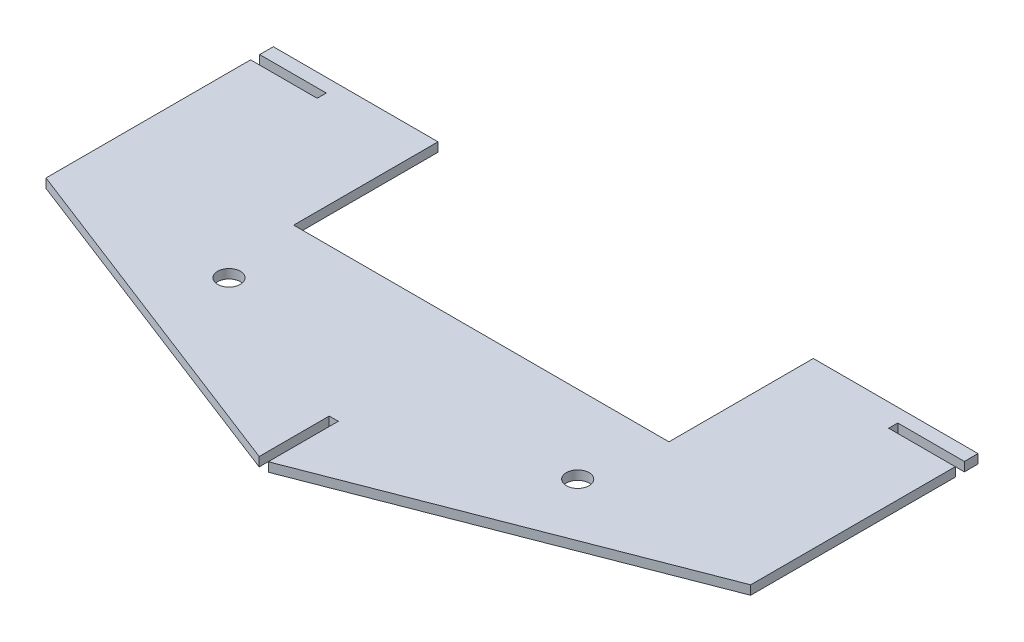
ISO-10303-21;
HEADER;
FILE_DESCRIPTION(('STEP AP214'),'2;1');
FILE_NAME('part.step','',(''),(''),'','','');
FILE_SCHEMA(('AUTOMOTIVE_DESIGN { 1 0 10303 214 1 1 1 1 }'));
ENDSEC;
DATA;
#1=APPLICATION_CONTEXT('core data for automotive mechanical design processes');
#2=APPLICATION_PROTOCOL_DEFINITION('international standard','automotive_design',2000,#1);
#3=PRODUCT_CONTEXT('',#1,'mechanical');
#4=PRODUCT('Part','Part','',(#3));
#5=PRODUCT_RELATED_PRODUCT_CATEGORY('part','',(#4));
#6=PRODUCT_DEFINITION_FORMATION('','',#4);
#7=PRODUCT_DEFINITION_CONTEXT('part definition',#1,'design');
#8=PRODUCT_DEFINITION('design','',#6,#7);
#9=PRODUCT_DEFINITION_SHAPE('','',#8);
#10=(LENGTH_UNIT() NAMED_UNIT(*) SI_UNIT(.MILLI.,.METRE.));
#11=(NAMED_UNIT(*) PLANE_ANGLE_UNIT() SI_UNIT($,.RADIAN.));
#12=(NAMED_UNIT(*) SI_UNIT($,.STERADIAN.) SOLID_ANGLE_UNIT());
#13=UNCERTAINTY_MEASURE_WITH_UNIT(LENGTH_MEASURE(1.E-05),#10,'distance_accuracy_value','');
#14=(GEOMETRIC_REPRESENTATION_CONTEXT(3) GLOBAL_UNCERTAINTY_ASSIGNED_CONTEXT((#13)) GLOBAL_UNIT_ASSIGNED_CONTEXT((#10,
#11,#12)) REPRESENTATION_CONTEXT('',''));
#15=CARTESIAN_POINT('',(0.,0.,0.));
#16=DIRECTION('',(0.,0.,1.));
#17=DIRECTION('',(1.,0.,0.));
#18=AXIS2_PLACEMENT_3D('',#15,#16,#17);
#19=CARTESIAN_POINT('',(0.,4.,0.));
#20=DIRECTION('',(0.,1.,0.));
#21=DIRECTION('',(0.,0.,1.));
#22=AXIS2_PLACEMENT_3D('',#19,#20,#21);
#23=PLANE('',#22);
#24=CARTESIAN_POINT('',(231.7,4.,97.8));
#25=DIRECTION('',(0.,1.,0.));
#26=DIRECTION('',(0.,0.,1.));
#27=AXIS2_PLACEMENT_3D('',#24,#25,#26);
#28=CIRCLE('',#27,5.00000000000002);
#29=CARTESIAN_POINT('',(231.7,4.,102.8));
#30=VERTEX_POINT('',#29);
#31=EDGE_CURVE('E269',#30,#30,#28,.F.);
#32=ORIENTED_EDGE('',*,*,#31,.T.);
#33=EDGE_LOOP('',(#32));
#34=FACE_BOUND('',#33,.T.);
#35=DIRECTION('',(0.,0.,1.));
#36=VECTOR('',#35,1.);
#37=CARTESIAN_POINT('',(72.45,4.,0.));
#38=LINE('',#37,#36);
#39=CARTESIAN_POINT('',(72.45,4.,0.));
#40=VERTEX_POINT('',#39);
#41=CARTESIAN_POINT('',(72.45,4.,63.5));
#42=VERTEX_POINT('',#41);
#43=EDGE_CURVE('E267',#40,#42,#38,.T.);
#44=ORIENTED_EDGE('',*,*,#43,.F.);
#45=DIRECTION('',(1.,0.,0.));
#46=VECTOR('',#45,1.);
#47=CARTESIAN_POINT('',(0.,4.,0.));
#48=LINE('',#47,#46);
#49=CARTESIAN_POINT('',(0.,4.,0.));
#50=VERTEX_POINT('',#49);
#51=EDGE_CURVE('E314',#50,#40,#48,.T.);
#52=ORIENTED_EDGE('',*,*,#51,.F.);
#53=DIRECTION('',(0.,0.,1.));
#54=VECTOR('',#53,1.);
#55=CARTESIAN_POINT('',(0.,4.,0.));
#56=LINE('',#55,#54);
#57=CARTESIAN_POINT('',(0.,4.,6.));
#58=VERTEX_POINT('',#57);
#59=EDGE_CURVE('E317',#50,#58,#56,.T.);
#60=ORIENTED_EDGE('',*,*,#59,.T.);
#61=DIRECTION('',(1.,0.,0.));
#62=VECTOR('',#61,1.);
#63=CARTESIAN_POINT('',(0.,4.,6.));
#64=LINE('',#63,#62);
#65=CARTESIAN_POINT('',(29.3,4.,6.));
#66=VERTEX_POINT('',#65);
#67=EDGE_CURVE('E320',#58,#66,#64,.T.);
#68=ORIENTED_EDGE('',*,*,#67,.T.);
#69=DIRECTION('',(0.,0.,1.));
#70=VECTOR('',#69,1.);
#71=CARTESIAN_POINT('',(29.3,4.,0.));
#72=LINE('',#71,#70);
#73=CARTESIAN_POINT('',(29.3,4.,10.));
#74=VERTEX_POINT('',#73);
#75=EDGE_CURVE('E323',#66,#74,#72,.T.);
#76=ORIENTED_EDGE('',*,*,#75,.T.);
#77=DIRECTION('',(1.,0.,0.));
#78=VECTOR('',#77,1.);
#79=CARTESIAN_POINT('',(0.,4.,10.));
#80=LINE('',#79,#78);
#81=CARTESIAN_POINT('',(0.,4.,10.));
#82=VERTEX_POINT('',#81);
#83=EDGE_CURVE('E325',#82,#74,#80,.T.);
#84=ORIENTED_EDGE('',*,*,#83,.F.);
#85=CARTESIAN_POINT('',(0.,4.,100.));
#86=VERTEX_POINT('',#85);
#87=EDGE_CURVE('E321',#82,#86,#56,.T.);
#88=ORIENTED_EDGE('',*,*,#87,.T.);
#89=DIRECTION('',(0.93256809827409,0.,0.360994102557712));
#90=VECTOR('',#89,1.);
#91=CARTESIAN_POINT('',(-33.6651583710407,4.,86.9683257918552));
#92=LINE('',#91,#90);
#93=CARTESIAN_POINT('',(153.,4.,159.225806451613));
#94=VERTEX_POINT('',#93);
#95=EDGE_CURVE('E173',#86,#94,#92,.T.);
#96=ORIENTED_EDGE('',*,*,#95,.T.);
#97=DIRECTION('',(0.,0.,-1.));
#98=VECTOR('',#97,1.);
#99=CARTESIAN_POINT('',(153.,4.,0.));
#100=LINE('',#99,#98);
#101=CARTESIAN_POINT('',(153.,4.,128.4));
#102=VERTEX_POINT('',#101);
#103=EDGE_CURVE('E165',#94,#102,#100,.T.);
#104=ORIENTED_EDGE('',*,*,#103,.T.);
#105=DIRECTION('',(1.,0.,0.));
#106=VECTOR('',#105,1.);
#107=CARTESIAN_POINT('',(0.,4.,128.4));
#108=LINE('',#107,#106);
#109=CARTESIAN_POINT('',(157.,4.,128.4));
#110=VERTEX_POINT('',#109);
#111=EDGE_CURVE('E170',#102,#110,#108,.T.);
#112=ORIENTED_EDGE('',*,*,#111,.T.);
#113=DIRECTION('',(0.,0.,-1.));
#114=VECTOR('',#113,1.);
#115=CARTESIAN_POINT('',(157.,4.,0.));
#116=LINE('',#115,#114);
#117=CARTESIAN_POINT('',(157.,4.,159.225806451613));
#118=VERTEX_POINT('',#117);
#119=EDGE_CURVE('E190',#118,#110,#116,.T.);
#120=ORIENTED_EDGE('',*,*,#119,.F.);
#121=DIRECTION('',(0.93256809827409,0.,-0.360994102557712));
#122=VECTOR('',#121,1.);
#123=CARTESIAN_POINT('',(74.0633484162896,4.,191.330316742081));
#124=LINE('',#123,#122);
#125=CARTESIAN_POINT('',(310.,4.,100.));
#126=VERTEX_POINT('',#125);
#127=EDGE_CURVE('E123',#118,#126,#124,.T.);
#128=ORIENTED_EDGE('',*,*,#127,.T.);
#129=DIRECTION('',(0.,0.,1.));
#130=VECTOR('',#129,1.);
#131=CARTESIAN_POINT('',(310.,4.,0.));
#132=LINE('',#131,#130);
#133=CARTESIAN_POINT('',(310.,4.,10.));
#134=VERTEX_POINT('',#133);
#135=EDGE_CURVE('E302',#134,#126,#132,.T.);
#136=ORIENTED_EDGE('',*,*,#135,.F.);
#137=DIRECTION('',(-1.,0.,0.));
#138=VECTOR('',#137,1.);
#139=CARTESIAN_POINT('',(0.,4.,10.));
#140=LINE('',#139,#138);
#141=CARTESIAN_POINT('',(280.7,4.,10.));
#142=VERTEX_POINT('',#141);
#143=EDGE_CURVE('E305',#134,#142,#140,.T.);
#144=ORIENTED_EDGE('',*,*,#143,.T.);
#145=DIRECTION('',(0.,0.,1.));
#146=VECTOR('',#145,1.);
#147=CARTESIAN_POINT('',(280.7,4.,0.));
#148=LINE('',#147,#146);
#149=CARTESIAN_POINT('',(280.7,4.,6.));
#150=VERTEX_POINT('',#149);
#151=EDGE_CURVE('E308',#150,#142,#148,.T.);
#152=ORIENTED_EDGE('',*,*,#151,.F.);
#153=DIRECTION('',(-1.,0.,0.));
#154=VECTOR('',#153,1.);
#155=CARTESIAN_POINT('',(0.,4.,5.99999999999999));
#156=LINE('',#155,#154);
#157=CARTESIAN_POINT('',(310.,4.,6.));
#158=VERTEX_POINT('',#157);
#159=EDGE_CURVE('E311',#158,#150,#156,.T.);
#160=ORIENTED_EDGE('',*,*,#159,.F.);
#161=CARTESIAN_POINT('',(310.,4.,0.));
#162=VERTEX_POINT('',#161);
#163=EDGE_CURVE('E306',#162,#158,#132,.T.);
#164=ORIENTED_EDGE('',*,*,#163,.F.);
#165=CARTESIAN_POINT('',(237.55,4.,0.));
#166=VERTEX_POINT('',#165);
#167=EDGE_CURVE('E318',#166,#162,#48,.T.);
#168=ORIENTED_EDGE('',*,*,#167,.F.);
#169=DIRECTION('',(0.,0.,-1.));
#170=VECTOR('',#169,1.);
#171=CARTESIAN_POINT('',(237.55,4.,0.));
#172=LINE('',#171,#170);
#173=CARTESIAN_POINT('',(237.55,4.,63.5));
#174=VERTEX_POINT('',#173);
#175=EDGE_CURVE('E280',#174,#166,#172,.T.);
#176=ORIENTED_EDGE('',*,*,#175,.F.);
#177=DIRECTION('',(1.,0.,0.));
#178=VECTOR('',#177,1.);
#179=CARTESIAN_POINT('',(72.45,4.,63.5));
#180=LINE('',#179,#178);
#181=EDGE_CURVE('E287',#42,#174,#180,.T.);
#182=ORIENTED_EDGE('',*,*,#181,.F.);
#183=EDGE_LOOP('',(#44,#52,#60,#68,#76,#84,#88,#96,#104,#112,#120,#128,#136,#144,#152,#160,#164,
#168,#176,#182));
#184=FACE_BOUND('',#183,.T.);
#185=CARTESIAN_POINT('',(78.3,4.,97.8));
#186=DIRECTION('',(0.,1.,0.));
#187=DIRECTION('',(0.,0.,1.));
#188=AXIS2_PLACEMENT_3D('',#185,#186,#187);
#189=CIRCLE('',#188,5.00000000000001);
#190=CARTESIAN_POINT('',(78.3,4.,102.8));
#191=VERTEX_POINT('',#190);
#192=EDGE_CURVE('E263',#191,#191,#189,.T.);
#193=ORIENTED_EDGE('',*,*,#192,.F.);
#194=EDGE_LOOP('',(#193));
#195=FACE_BOUND('',#194,.T.);
#196=ADVANCED_FACE('F35',(#34,#184,#195),#23,.T.);
#197=CARTESIAN_POINT('',(0.,0.,0.));
#198=DIRECTION('',(0.,1.,0.));
#199=DIRECTION('',(0.,0.,1.));
#200=AXIS2_PLACEMENT_3D('',#197,#198,#199);
#201=PLANE('',#200);
#202=DIRECTION('',(1.,0.,0.));
#203=VECTOR('',#202,1.);
#204=CARTESIAN_POINT('',(0.,0.,0.));
#205=LINE('',#204,#203);
#206=CARTESIAN_POINT('',(0.,0.,0.));
#207=VERTEX_POINT('',#206);
#208=CARTESIAN_POINT('',(72.45,0.,0.));
#209=VERTEX_POINT('',#208);
#210=EDGE_CURVE('E211',#207,#209,#205,.T.);
#211=ORIENTED_EDGE('',*,*,#210,.T.);
#212=DIRECTION('',(0.,0.,1.));
#213=VECTOR('',#212,1.);
#214=CARTESIAN_POINT('',(72.45,0.,0.));
#215=LINE('',#214,#213);
#216=CARTESIAN_POINT('',(72.45,0.,63.5));
#217=VERTEX_POINT('',#216);
#218=EDGE_CURVE('E276',#209,#217,#215,.T.);
#219=ORIENTED_EDGE('',*,*,#218,.T.);
#220=DIRECTION('',(1.,0.,0.));
#221=VECTOR('',#220,1.);
#222=CARTESIAN_POINT('',(72.45,0.,63.5));
#223=LINE('',#222,#221);
#224=CARTESIAN_POINT('',(237.55,0.,63.5));
#225=VERTEX_POINT('',#224);
#226=EDGE_CURVE('E279',#217,#225,#223,.T.);
#227=ORIENTED_EDGE('',*,*,#226,.T.);
#228=DIRECTION('',(0.,0.,-1.));
#229=VECTOR('',#228,1.);
#230=CARTESIAN_POINT('',(237.55,0.,0.));
#231=LINE('',#230,#229);
#232=CARTESIAN_POINT('',(237.55,0.,0.));
#233=VERTEX_POINT('',#232);
#234=EDGE_CURVE('E52',#225,#233,#231,.T.);
#235=ORIENTED_EDGE('',*,*,#234,.T.);
#236=CARTESIAN_POINT('',(310.,0.,0.));
#237=VERTEX_POINT('',#236);
#238=EDGE_CURVE('E215',#233,#237,#205,.T.);
#239=ORIENTED_EDGE('',*,*,#238,.T.);
#240=DIRECTION('',(0.,0.,1.));
#241=VECTOR('',#240,1.);
#242=CARTESIAN_POINT('',(310.,0.,0.));
#243=LINE('',#242,#241);
#244=CARTESIAN_POINT('',(310.,0.,6.));
#245=VERTEX_POINT('',#244);
#246=EDGE_CURVE('E202',#237,#245,#243,.T.);
#247=ORIENTED_EDGE('',*,*,#246,.T.);
#248=DIRECTION('',(-1.,0.,0.));
#249=VECTOR('',#248,1.);
#250=CARTESIAN_POINT('',(0.,0.,5.99999999999999));
#251=LINE('',#250,#249);
#252=CARTESIAN_POINT('',(280.7,0.,6.));
#253=VERTEX_POINT('',#252);
#254=EDGE_CURVE('E208',#245,#253,#251,.T.);
#255=ORIENTED_EDGE('',*,*,#254,.T.);
#256=DIRECTION('',(0.,0.,1.));
#257=VECTOR('',#256,1.);
#258=CARTESIAN_POINT('',(280.7,0.,0.));
#259=LINE('',#258,#257);
#260=CARTESIAN_POINT('',(280.7,0.,10.));
#261=VERTEX_POINT('',#260);
#262=EDGE_CURVE('E205',#253,#261,#259,.T.);
#263=ORIENTED_EDGE('',*,*,#262,.T.);
#264=DIRECTION('',(-1.,0.,0.));
#265=VECTOR('',#264,1.);
#266=CARTESIAN_POINT('',(0.,0.,10.));
#267=LINE('',#266,#265);
#268=CARTESIAN_POINT('',(310.,0.,10.));
#269=VERTEX_POINT('',#268);
#270=EDGE_CURVE('E201',#269,#261,#267,.T.);
#271=ORIENTED_EDGE('',*,*,#270,.F.);
#272=CARTESIAN_POINT('',(310.,0.,100.));
#273=VERTEX_POINT('',#272);
#274=EDGE_CURVE('E197',#269,#273,#243,.T.);
#275=ORIENTED_EDGE('',*,*,#274,.T.);
#276=DIRECTION('',(0.93256809827409,0.,-0.360994102557712));
#277=VECTOR('',#276,1.);
#278=CARTESIAN_POINT('',(74.0633484162896,0.,191.330316742081));
#279=LINE('',#278,#277);
#280=CARTESIAN_POINT('',(157.,0.,159.225806451613));
#281=VERTEX_POINT('',#280);
#282=EDGE_CURVE('E195',#281,#273,#279,.T.);
#283=ORIENTED_EDGE('',*,*,#282,.F.);
#284=DIRECTION('',(0.,0.,-1.));
#285=VECTOR('',#284,1.);
#286=CARTESIAN_POINT('',(157.,0.,0.));
#287=LINE('',#286,#285);
#288=CARTESIAN_POINT('',(157.,0.,128.4));
#289=VERTEX_POINT('',#288);
#290=EDGE_CURVE('E231',#281,#289,#287,.T.);
#291=ORIENTED_EDGE('',*,*,#290,.T.);
#292=DIRECTION('',(1.,0.,0.));
#293=VECTOR('',#292,1.);
#294=CARTESIAN_POINT('',(0.,0.,128.4));
#295=LINE('',#294,#293);
#296=CARTESIAN_POINT('',(153.,0.,128.4));
#297=VERTEX_POINT('',#296);
#298=EDGE_CURVE('E229',#297,#289,#295,.T.);
#299=ORIENTED_EDGE('',*,*,#298,.F.);
#300=DIRECTION('',(0.,0.,-1.));
#301=VECTOR('',#300,1.);
#302=CARTESIAN_POINT('',(153.,0.,0.));
#303=LINE('',#302,#301);
#304=CARTESIAN_POINT('',(153.,0.,159.225806451613));
#305=VERTEX_POINT('',#304);
#306=EDGE_CURVE('E182',#305,#297,#303,.T.);
#307=ORIENTED_EDGE('',*,*,#306,.F.);
#308=DIRECTION('',(0.93256809827409,0.,0.360994102557712));
#309=VECTOR('',#308,1.);
#310=CARTESIAN_POINT('',(-33.6651583710407,0.,86.9683257918552));
#311=LINE('',#310,#309);
#312=CARTESIAN_POINT('',(0.,0.,100.));
#313=VERTEX_POINT('',#312);
#314=EDGE_CURVE('E226',#313,#305,#311,.T.);
#315=ORIENTED_EDGE('',*,*,#314,.F.);
#316=DIRECTION('',(0.,0.,1.));
#317=VECTOR('',#316,1.);
#318=CARTESIAN_POINT('',(0.,0.,0.));
#319=LINE('',#318,#317);
#320=CARTESIAN_POINT('',(0.,0.,10.));
#321=VERTEX_POINT('',#320);
#322=EDGE_CURVE('E218',#321,#313,#319,.T.);
#323=ORIENTED_EDGE('',*,*,#322,.F.);
#324=DIRECTION('',(1.,0.,0.));
#325=VECTOR('',#324,1.);
#326=CARTESIAN_POINT('',(0.,0.,10.));
#327=LINE('',#326,#325);
#328=CARTESIAN_POINT('',(29.3,0.,10.));
#329=VERTEX_POINT('',#328);
#330=EDGE_CURVE('E223',#321,#329,#327,.T.);
#331=ORIENTED_EDGE('',*,*,#330,.T.);
#332=DIRECTION('',(0.,0.,1.));
#333=VECTOR('',#332,1.);
#334=CARTESIAN_POINT('',(29.3,0.,0.));
#335=LINE('',#334,#333);
#336=CARTESIAN_POINT('',(29.3,0.,6.));
#337=VERTEX_POINT('',#336);
#338=EDGE_CURVE('E220',#337,#329,#335,.T.);
#339=ORIENTED_EDGE('',*,*,#338,.F.);
#340=DIRECTION('',(1.,0.,0.));
#341=VECTOR('',#340,1.);
#342=CARTESIAN_POINT('',(0.,0.,6.));
#343=LINE('',#342,#341);
#344=CARTESIAN_POINT('',(0.,0.,6.));
#345=VERTEX_POINT('',#344);
#346=EDGE_CURVE('E217',#345,#337,#343,.T.);
#347=ORIENTED_EDGE('',*,*,#346,.F.);
#348=EDGE_CURVE('E214',#207,#345,#319,.T.);
#349=ORIENTED_EDGE('',*,*,#348,.F.);
#350=EDGE_LOOP('',(#211,#219,#227,#235,#239,#247,#255,#263,#271,#275,#283,#291,#299,#307,#315,
#323,#331,#339,#347,#349));
#351=FACE_BOUND('',#350,.T.);
#352=CARTESIAN_POINT('',(231.7,0.,97.8));
#353=DIRECTION('',(0.,1.,0.));
#354=DIRECTION('',(0.,0.,1.));
#355=AXIS2_PLACEMENT_3D('',#352,#353,#354);
#356=CIRCLE('',#355,5.00000000000002);
#357=CARTESIAN_POINT('',(231.7,0.,102.8));
#358=VERTEX_POINT('',#357);
#359=EDGE_CURVE('E261',#358,#358,#356,.F.);
#360=ORIENTED_EDGE('',*,*,#359,.F.);
#361=EDGE_LOOP('',(#360));
#362=FACE_BOUND('',#361,.T.);
#363=CARTESIAN_POINT('',(78.3,0.,97.8));
#364=DIRECTION('',(0.,1.,0.));
#365=DIRECTION('',(0.,0.,1.));
#366=AXIS2_PLACEMENT_3D('',#363,#364,#365);
#367=CIRCLE('',#366,5.00000000000001);
#368=CARTESIAN_POINT('',(78.3,0.,102.8));
#369=VERTEX_POINT('',#368);
#370=EDGE_CURVE('E39',#369,#369,#367,.T.);
#371=ORIENTED_EDGE('',*,*,#370,.T.);
#372=EDGE_LOOP('',(#371));
#373=FACE_BOUND('',#372,.T.);
#374=ADVANCED_FACE('F337',(#351,#362,#373),#201,.F.);
#375=CARTESIAN_POINT('',(0.,4.,0.));
#376=DIRECTION('',(0.,0.,-1.));
#377=DIRECTION('',(-1.,0.,0.));
#378=AXIS2_PLACEMENT_3D('',#375,#376,#377);
#379=PLANE('',#378);
#380=DIRECTION('',(0.,1.,0.));
#381=VECTOR('',#380,1.);
#382=CARTESIAN_POINT('',(72.45,0.,0.));
#383=LINE('',#382,#381);
#384=EDGE_CURVE('E198',#209,#40,#383,.T.);
#385=ORIENTED_EDGE('',*,*,#384,.F.);
#386=ORIENTED_EDGE('',*,*,#210,.F.);
#387=DIRECTION('',(0.,-1.,0.));
#388=VECTOR('',#387,1.);
#389=CARTESIAN_POINT('',(0.,4.,0.));
#390=LINE('',#389,#388);
#391=EDGE_CURVE('E250',#50,#207,#390,.T.);
#392=ORIENTED_EDGE('',*,*,#391,.F.);
#393=ORIENTED_EDGE('',*,*,#51,.T.);
#394=EDGE_LOOP('',(#385,#386,#392,#393));
#395=FACE_BOUND('',#394,.T.);
#396=ADVANCED_FACE('F358',(#395),#379,.T.);
#397=CARTESIAN_POINT('',(74.0633484162896,4.,191.330316742081));
#398=DIRECTION('',(-0.360994102557712,0.,-0.93256809827409));
#399=DIRECTION('',(-0.93256809827409,0.,0.360994102557712));
#400=AXIS2_PLACEMENT_3D('',#397,#398,#399);
#401=PLANE('',#400);
#402=ORIENTED_EDGE('',*,*,#282,.T.);
#403=DIRECTION('',(0.,-1.,0.));
#404=VECTOR('',#403,1.);
#405=CARTESIAN_POINT('',(310.,4.,100.));
#406=LINE('',#405,#404);
#407=EDGE_CURVE('E11',#126,#273,#406,.T.);
#408=ORIENTED_EDGE('',*,*,#407,.F.);
#409=ORIENTED_EDGE('',*,*,#127,.F.);
#410=DIRECTION('',(0.,-1.,0.));
#411=VECTOR('',#410,1.);
#412=CARTESIAN_POINT('',(157.,4.,159.225806451613));
#413=LINE('',#412,#411);
#414=EDGE_CURVE('E61',#118,#281,#413,.T.);
#415=ORIENTED_EDGE('',*,*,#414,.T.);
#416=EDGE_LOOP('',(#402,#408,#409,#415));
#417=FACE_BOUND('',#416,.T.);
#418=ADVANCED_FACE('F37',(#417),#401,.F.);
#419=CARTESIAN_POINT('',(310.,4.,0.));
#420=DIRECTION('',(1.,0.,0.));
#421=DIRECTION('',(0.,0.,-1.));
#422=AXIS2_PLACEMENT_3D('',#419,#420,#421);
#423=PLANE('',#422);
#424=ORIENTED_EDGE('',*,*,#274,.F.);
#425=DIRECTION('',(0.,-1.,0.));
#426=VECTOR('',#425,1.);
#427=CARTESIAN_POINT('',(310.,4.,10.));
#428=LINE('',#427,#426);
#429=EDGE_CURVE('E44',#134,#269,#428,.T.);
#430=ORIENTED_EDGE('',*,*,#429,.F.);
#431=ORIENTED_EDGE('',*,*,#135,.T.);
#432=ORIENTED_EDGE('',*,*,#407,.T.);
#433=EDGE_LOOP('',(#424,#430,#431,#432));
#434=FACE_BOUND('',#433,.T.);
#435=ADVANCED_FACE('F499',(#434),#423,.T.);
#436=CARTESIAN_POINT('',(0.,4.,10.));
#437=DIRECTION('',(0.,0.,1.));
#438=DIRECTION('',(1.,0.,0.));
#439=AXIS2_PLACEMENT_3D('',#436,#437,#438);
#440=PLANE('',#439);
#441=ORIENTED_EDGE('',*,*,#270,.T.);
#442=DIRECTION('',(0.,-1.,0.));
#443=VECTOR('',#442,1.);
#444=CARTESIAN_POINT('',(280.7,4.,10.));
#445=LINE('',#444,#443);
#446=EDGE_CURVE('E259',#142,#261,#445,.T.);
#447=ORIENTED_EDGE('',*,*,#446,.F.);
#448=ORIENTED_EDGE('',*,*,#143,.F.);
#449=ORIENTED_EDGE('',*,*,#429,.T.);
#450=EDGE_LOOP('',(#441,#447,#448,#449));
#451=FACE_BOUND('',#450,.T.);
#452=ADVANCED_FACE('F517',(#451),#440,.F.);
#453=CARTESIAN_POINT('',(280.7,4.,0.));
#454=DIRECTION('',(1.,0.,0.));
#455=DIRECTION('',(0.,0.,-1.));
#456=AXIS2_PLACEMENT_3D('',#453,#454,#455);
#457=PLANE('',#456);
#458=ORIENTED_EDGE('',*,*,#262,.F.);
#459=DIRECTION('',(0.,-1.,0.));
#460=VECTOR('',#459,1.);
#461=CARTESIAN_POINT('',(280.7,4.,6.));
#462=LINE('',#461,#460);
#463=EDGE_CURVE('E257',#150,#253,#462,.T.);
#464=ORIENTED_EDGE('',*,*,#463,.F.);
#465=ORIENTED_EDGE('',*,*,#151,.T.);
#466=ORIENTED_EDGE('',*,*,#446,.T.);
#467=EDGE_LOOP('',(#458,#464,#465,#466));
#468=FACE_BOUND('',#467,.T.);
#469=ADVANCED_FACE('F507',(#468),#457,.T.);
#470=CARTESIAN_POINT('',(0.,4.,5.99999999999999));
#471=DIRECTION('',(0.,0.,1.));
#472=DIRECTION('',(1.,0.,0.));
#473=AXIS2_PLACEMENT_3D('',#470,#471,#472);
#474=PLANE('',#473);
#475=ORIENTED_EDGE('',*,*,#254,.F.);
#476=DIRECTION('',(0.,-1.,0.));
#477=VECTOR('',#476,1.);
#478=CARTESIAN_POINT('',(310.,4.,6.));
#479=LINE('',#478,#477);
#480=EDGE_CURVE('E255',#158,#245,#479,.T.);
#481=ORIENTED_EDGE('',*,*,#480,.F.);
#482=ORIENTED_EDGE('',*,*,#159,.T.);
#483=ORIENTED_EDGE('',*,*,#463,.T.);
#484=EDGE_LOOP('',(#475,#481,#482,#483));
#485=FACE_BOUND('',#484,.T.);
#486=ADVANCED_FACE('F496',(#485),#474,.T.);
#487=ORIENTED_EDGE('',*,*,#246,.F.);
#488=DIRECTION('',(0.,-1.,0.));
#489=VECTOR('',#488,1.);
#490=CARTESIAN_POINT('',(310.,4.,0.));
#491=LINE('',#490,#489);
#492=EDGE_CURVE('E252',#162,#237,#491,.T.);
#493=ORIENTED_EDGE('',*,*,#492,.F.);
#494=ORIENTED_EDGE('',*,*,#163,.T.);
#495=ORIENTED_EDGE('',*,*,#480,.T.);
#496=EDGE_LOOP('',(#487,#493,#494,#495));
#497=FACE_BOUND('',#496,.T.);
#498=ADVANCED_FACE('F406',(#497),#423,.T.);
#499=DIRECTION('',(0.,1.,0.));
#500=VECTOR('',#499,1.);
#501=CARTESIAN_POINT('',(237.55,0.,0.));
#502=LINE('',#501,#500);
#503=EDGE_CURVE('E294',#233,#166,#502,.T.);
#504=ORIENTED_EDGE('',*,*,#503,.T.);
#505=ORIENTED_EDGE('',*,*,#167,.T.);
#506=ORIENTED_EDGE('',*,*,#492,.T.);
#507=ORIENTED_EDGE('',*,*,#238,.F.);
#508=EDGE_LOOP('',(#504,#505,#506,#507));
#509=FACE_BOUND('',#508,.T.);
#510=ADVANCED_FACE('F400',(#509),#379,.T.);
#511=CARTESIAN_POINT('',(0.,4.,0.));
#512=DIRECTION('',(1.,0.,0.));
#513=DIRECTION('',(0.,0.,-1.));
#514=AXIS2_PLACEMENT_3D('',#511,#512,#513);
#515=PLANE('',#514);
#516=ORIENTED_EDGE('',*,*,#348,.T.);
#517=DIRECTION('',(0.,-1.,0.));
#518=VECTOR('',#517,1.);
#519=CARTESIAN_POINT('',(0.,4.,6.));
#520=LINE('',#519,#518);
#521=EDGE_CURVE('E247',#58,#345,#520,.T.);
#522=ORIENTED_EDGE('',*,*,#521,.F.);
#523=ORIENTED_EDGE('',*,*,#59,.F.);
#524=ORIENTED_EDGE('',*,*,#391,.T.);
#525=EDGE_LOOP('',(#516,#522,#523,#524));
#526=FACE_BOUND('',#525,.T.);
#527=ADVANCED_FACE('F405',(#526),#515,.F.);
#528=CARTESIAN_POINT('',(0.,4.,6.));
#529=DIRECTION('',(0.,0.,-1.));
#530=DIRECTION('',(-1.,0.,0.));
#531=AXIS2_PLACEMENT_3D('',#528,#529,#530);
#532=PLANE('',#531);
#533=ORIENTED_EDGE('',*,*,#346,.T.);
#534=DIRECTION('',(0.,-1.,0.));
#535=VECTOR('',#534,1.);
#536=CARTESIAN_POINT('',(29.3,4.,6.));
#537=LINE('',#536,#535);
#538=EDGE_CURVE('E244',#66,#337,#537,.T.);
#539=ORIENTED_EDGE('',*,*,#538,.F.);
#540=ORIENTED_EDGE('',*,*,#67,.F.);
#541=ORIENTED_EDGE('',*,*,#521,.T.);
#542=EDGE_LOOP('',(#533,#539,#540,#541));
#543=FACE_BOUND('',#542,.T.);
#544=ADVANCED_FACE('F473',(#543),#532,.F.);
#545=CARTESIAN_POINT('',(29.3,4.,0.));
#546=DIRECTION('',(1.,0.,0.));
#547=DIRECTION('',(0.,0.,-1.));
#548=AXIS2_PLACEMENT_3D('',#545,#546,#547);
#549=PLANE('',#548);
#550=ORIENTED_EDGE('',*,*,#338,.T.);
#551=DIRECTION('',(0.,-1.,0.));
#552=VECTOR('',#551,1.);
#553=CARTESIAN_POINT('',(29.3,4.,10.));
#554=LINE('',#553,#552);
#555=EDGE_CURVE('E242',#74,#329,#554,.T.);
#556=ORIENTED_EDGE('',*,*,#555,.F.);
#557=ORIENTED_EDGE('',*,*,#75,.F.);
#558=ORIENTED_EDGE('',*,*,#538,.T.);
#559=EDGE_LOOP('',(#550,#556,#557,#558));
#560=FACE_BOUND('',#559,.T.);
#561=ADVANCED_FACE('F463',(#560),#549,.F.);
#562=CARTESIAN_POINT('',(0.,4.,10.));
#563=DIRECTION('',(0.,0.,-1.));
#564=DIRECTION('',(-1.,0.,0.));
#565=AXIS2_PLACEMENT_3D('',#562,#563,#564);
#566=PLANE('',#565);
#567=ORIENTED_EDGE('',*,*,#330,.F.);
#568=DIRECTION('',(0.,-1.,0.));
#569=VECTOR('',#568,1.);
#570=CARTESIAN_POINT('',(0.,4.,10.));
#571=LINE('',#570,#569);
#572=EDGE_CURVE('E240',#82,#321,#571,.T.);
#573=ORIENTED_EDGE('',*,*,#572,.F.);
#574=ORIENTED_EDGE('',*,*,#83,.T.);
#575=ORIENTED_EDGE('',*,*,#555,.T.);
#576=EDGE_LOOP('',(#567,#573,#574,#575));
#577=FACE_BOUND('',#576,.T.);
#578=ADVANCED_FACE('F454',(#577),#566,.T.);
#579=ORIENTED_EDGE('',*,*,#322,.T.);
#580=DIRECTION('',(0.,-1.,0.));
#581=VECTOR('',#580,1.);
#582=CARTESIAN_POINT('',(0.,4.,100.));
#583=LINE('',#582,#581);
#584=EDGE_CURVE('E237',#86,#313,#583,.T.);
#585=ORIENTED_EDGE('',*,*,#584,.F.);
#586=ORIENTED_EDGE('',*,*,#87,.F.);
#587=ORIENTED_EDGE('',*,*,#572,.T.);
#588=EDGE_LOOP('',(#579,#585,#586,#587));
#589=FACE_BOUND('',#588,.T.);
#590=ADVANCED_FACE('F331',(#589),#515,.F.);
#591=CARTESIAN_POINT('',(-33.6651583710407,4.,86.9683257918552));
#592=DIRECTION('',(0.360994102557712,0.,-0.93256809827409));
#593=DIRECTION('',(-0.93256809827409,0.,-0.360994102557712));
#594=AXIS2_PLACEMENT_3D('',#591,#592,#593);
#595=PLANE('',#594);
#596=ORIENTED_EDGE('',*,*,#314,.T.);
#597=DIRECTION('',(0.,-1.,0.));
#598=VECTOR('',#597,1.);
#599=CARTESIAN_POINT('',(153.,4.,159.225806451613));
#600=LINE('',#599,#598);
#601=EDGE_CURVE('E186',#94,#305,#600,.T.);
#602=ORIENTED_EDGE('',*,*,#601,.F.);
#603=ORIENTED_EDGE('',*,*,#95,.F.);
#604=ORIENTED_EDGE('',*,*,#584,.T.);
#605=EDGE_LOOP('',(#596,#602,#603,#604));
#606=FACE_BOUND('',#605,.T.);
#607=ADVANCED_FACE('F335',(#606),#595,.F.);
#608=CARTESIAN_POINT('',(153.,4.,0.));
#609=DIRECTION('',(-1.,0.,0.));
#610=DIRECTION('',(0.,0.,1.));
#611=AXIS2_PLACEMENT_3D('',#608,#609,#610);
#612=PLANE('',#611);
#613=ORIENTED_EDGE('',*,*,#306,.T.);
#614=DIRECTION('',(0.,-1.,0.));
#615=VECTOR('',#614,1.);
#616=CARTESIAN_POINT('',(153.,4.,128.4));
#617=LINE('',#616,#615);
#618=EDGE_CURVE('E179',#102,#297,#617,.T.);
#619=ORIENTED_EDGE('',*,*,#618,.F.);
#620=ORIENTED_EDGE('',*,*,#103,.F.);
#621=ORIENTED_EDGE('',*,*,#601,.T.);
#622=EDGE_LOOP('',(#613,#619,#620,#621));
#623=FACE_BOUND('',#622,.T.);
#624=ADVANCED_FACE('F180',(#623),#612,.F.);
#625=CARTESIAN_POINT('',(0.,4.,128.4));
#626=DIRECTION('',(0.,0.,-1.));
#627=DIRECTION('',(-1.,0.,0.));
#628=AXIS2_PLACEMENT_3D('',#625,#626,#627);
#629=PLANE('',#628);
#630=ORIENTED_EDGE('',*,*,#298,.T.);
#631=DIRECTION('',(0.,-1.,0.));
#632=VECTOR('',#631,1.);
#633=CARTESIAN_POINT('',(157.,4.,128.4));
#634=LINE('',#633,#632);
#635=EDGE_CURVE('E187',#110,#289,#634,.T.);
#636=ORIENTED_EDGE('',*,*,#635,.F.);
#637=ORIENTED_EDGE('',*,*,#111,.F.);
#638=ORIENTED_EDGE('',*,*,#618,.T.);
#639=EDGE_LOOP('',(#630,#636,#637,#638));
#640=FACE_BOUND('',#639,.T.);
#641=ADVANCED_FACE('F189',(#640),#629,.F.);
#642=CARTESIAN_POINT('',(157.,4.,0.));
#643=DIRECTION('',(-1.,0.,0.));
#644=DIRECTION('',(0.,0.,1.));
#645=AXIS2_PLACEMENT_3D('',#642,#643,#644);
#646=PLANE('',#645);
#647=ORIENTED_EDGE('',*,*,#290,.F.);
#648=ORIENTED_EDGE('',*,*,#414,.F.);
#649=ORIENTED_EDGE('',*,*,#119,.T.);
#650=ORIENTED_EDGE('',*,*,#635,.T.);
#651=EDGE_LOOP('',(#647,#648,#649,#650));
#652=FACE_BOUND('',#651,.T.);
#653=ADVANCED_FACE('F339',(#652),#646,.T.);
#654=CARTESIAN_POINT('',(72.45,0.,0.));
#655=DIRECTION('',(-1.,0.,0.));
#656=DIRECTION('',(0.,0.,1.));
#657=AXIS2_PLACEMENT_3D('',#654,#655,#656);
#658=PLANE('',#657);
#659=ORIENTED_EDGE('',*,*,#43,.T.);
#660=DIRECTION('',(0.,1.,0.));
#661=VECTOR('',#660,1.);
#662=CARTESIAN_POINT('',(72.45,0.,63.5));
#663=LINE('',#662,#661);
#664=EDGE_CURVE('E284',#217,#42,#663,.T.);
#665=ORIENTED_EDGE('',*,*,#664,.F.);
#666=ORIENTED_EDGE('',*,*,#218,.F.);
#667=ORIENTED_EDGE('',*,*,#384,.T.);
#668=EDGE_LOOP('',(#659,#665,#666,#667));
#669=FACE_BOUND('',#668,.T.);
#670=ADVANCED_FACE('F341',(#669),#658,.F.);
#671=CARTESIAN_POINT('',(237.55,0.,0.));
#672=DIRECTION('',(1.,0.,0.));
#673=DIRECTION('',(0.,0.,-1.));
#674=AXIS2_PLACEMENT_3D('',#671,#672,#673);
#675=PLANE('',#674);
#676=ORIENTED_EDGE('',*,*,#175,.T.);
#677=ORIENTED_EDGE('',*,*,#503,.F.);
#678=ORIENTED_EDGE('',*,*,#234,.F.);
#679=DIRECTION('',(0.,1.,0.));
#680=VECTOR('',#679,1.);
#681=CARTESIAN_POINT('',(237.55,0.,63.5));
#682=LINE('',#681,#680);
#683=EDGE_CURVE('E297',#225,#174,#682,.T.);
#684=ORIENTED_EDGE('',*,*,#683,.T.);
#685=EDGE_LOOP('',(#676,#677,#678,#684));
#686=FACE_BOUND('',#685,.T.);
#687=ADVANCED_FACE('F347',(#686),#675,.F.);
#688=CARTESIAN_POINT('',(72.45,0.,63.5));
#689=DIRECTION('',(0.,0.,1.));
#690=DIRECTION('',(1.,0.,0.));
#691=AXIS2_PLACEMENT_3D('',#688,#689,#690);
#692=PLANE('',#691);
#693=ORIENTED_EDGE('',*,*,#181,.T.);
#694=ORIENTED_EDGE('',*,*,#683,.F.);
#695=ORIENTED_EDGE('',*,*,#226,.F.);
#696=ORIENTED_EDGE('',*,*,#664,.T.);
#697=EDGE_LOOP('',(#693,#694,#695,#696));
#698=FACE_BOUND('',#697,.T.);
#699=ADVANCED_FACE('F360',(#698),#692,.F.);
#700=CARTESIAN_POINT('',(231.7,-6.,97.8));
#701=DIRECTION('',(0.,1.,0.));
#702=DIRECTION('',(0.,0.,1.));
#703=AXIS2_PLACEMENT_3D('',#700,#701,#702);
#704=CYLINDRICAL_SURFACE('',#703,5.00000000000002);
#705=ORIENTED_EDGE('',*,*,#31,.F.);
#706=EDGE_LOOP('',(#705));
#707=FACE_BOUND('',#706,.T.);
#708=ORIENTED_EDGE('',*,*,#359,.T.);
#709=EDGE_LOOP('',(#708));
#710=FACE_BOUND('',#709,.T.);
#711=ADVANCED_FACE('F363',(#707,#710),#704,.F.);
#712=CARTESIAN_POINT('',(78.3,-6.,97.8));
#713=DIRECTION('',(0.,1.,0.));
#714=DIRECTION('',(0.,0.,1.));
#715=AXIS2_PLACEMENT_3D('',#712,#713,#714);
#716=CYLINDRICAL_SURFACE('',#715,5.00000000000001);
#717=ORIENTED_EDGE('',*,*,#192,.T.);
#718=EDGE_LOOP('',(#717));
#719=FACE_BOUND('',#718,.T.);
#720=ORIENTED_EDGE('',*,*,#370,.F.);
#721=EDGE_LOOP('',(#720));
#722=FACE_BOUND('',#721,.T.);
#723=ADVANCED_FACE('F369',(#719,#722),#716,.F.);
#724=CLOSED_SHELL('',(#196,#374,#396,#418,#435,#452,#469,#486,#498,#510,#527,#544,#561,#578,
#590,#607,#624,#641,#653,#670,#687,#699,#711,#723));
#725=MANIFOLD_SOLID_BREP('B2',#724);
#726=ADVANCED_BREP_SHAPE_REPRESENTATION('',(#18,#725),#14);
#727=SHAPE_DEFINITION_REPRESENTATION(#9,#726);
ENDSEC;
END-ISO-10303-21;
